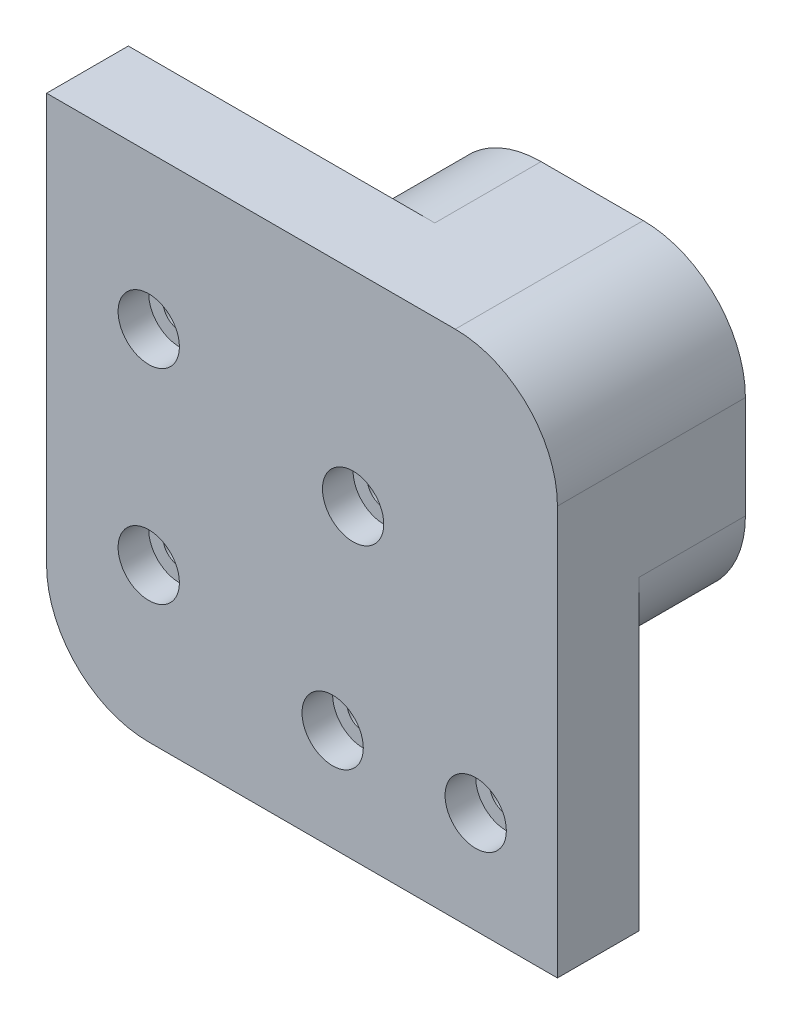
ISO-10303-21;
HEADER;
FILE_DESCRIPTION(('STEP AP214'),'2;1');
FILE_NAME('part.step','',(''),(''),'','','');
FILE_SCHEMA(('AUTOMOTIVE_DESIGN { 1 0 10303 214 1 1 1 1 }'));
ENDSEC;
DATA;
#1=APPLICATION_CONTEXT('core data for automotive mechanical design processes');
#2=APPLICATION_PROTOCOL_DEFINITION('international standard','automotive_design',2000,#1);
#3=PRODUCT_CONTEXT('',#1,'mechanical');
#4=PRODUCT('Part','Part','',(#3));
#5=PRODUCT_RELATED_PRODUCT_CATEGORY('part','',(#4));
#6=PRODUCT_DEFINITION_FORMATION('','',#4);
#7=PRODUCT_DEFINITION_CONTEXT('part definition',#1,'design');
#8=PRODUCT_DEFINITION('design','',#6,#7);
#9=PRODUCT_DEFINITION_SHAPE('','',#8);
#10=(LENGTH_UNIT() NAMED_UNIT(*) SI_UNIT(.MILLI.,.METRE.));
#11=(NAMED_UNIT(*) PLANE_ANGLE_UNIT() SI_UNIT($,.RADIAN.));
#12=(NAMED_UNIT(*) SI_UNIT($,.STERADIAN.) SOLID_ANGLE_UNIT());
#13=UNCERTAINTY_MEASURE_WITH_UNIT(LENGTH_MEASURE(1.E-05),#10,'distance_accuracy_value','');
#14=(GEOMETRIC_REPRESENTATION_CONTEXT(3) GLOBAL_UNCERTAINTY_ASSIGNED_CONTEXT((#13)) GLOBAL_UNIT_ASSIGNED_CONTEXT((#10,
#11,#12)) REPRESENTATION_CONTEXT('',''));
#15=CARTESIAN_POINT('',(0.,0.,0.));
#16=DIRECTION('',(0.,0.,1.));
#17=DIRECTION('',(1.,0.,0.));
#18=AXIS2_PLACEMENT_3D('',#15,#16,#17);
#19=CARTESIAN_POINT('',(20.,-130.028839026674,-52.8467532408376));
#20=DIRECTION('',(0.,0.,1.));
#21=DIRECTION('',(1.,0.,0.));
#22=AXIS2_PLACEMENT_3D('',#19,#20,#21);
#23=CYLINDRICAL_SURFACE('',#22,1.6);
#24=CARTESIAN_POINT('',(20.,-130.028839026674,-10.399949199898));
#25=DIRECTION('',(0.,0.,1.));
#26=DIRECTION('',(1.,0.,0.));
#27=AXIS2_PLACEMENT_3D('',#24,#25,#26);
#28=CIRCLE('',#27,1.6);
#29=CARTESIAN_POINT('',(21.6,-130.028839026674,-10.399949199898));
#30=VERTEX_POINT('',#29);
#31=EDGE_CURVE('E172',#30,#30,#28,.F.);
#32=ORIENTED_EDGE('',*,*,#31,.T.);
#33=EDGE_LOOP('',(#32));
#34=FACE_BOUND('',#33,.T.);
#35=CARTESIAN_POINT('',(20.,-130.028839026674,5.));
#36=DIRECTION('',(0.,0.,1.));
#37=DIRECTION('',(1.,0.,0.));
#38=AXIS2_PLACEMENT_3D('',#35,#36,#37);
#39=CIRCLE('',#38,1.6);
#40=CARTESIAN_POINT('',(21.6,-130.028839026674,5.));
#41=VERTEX_POINT('',#40);
#42=EDGE_CURVE('E151',#41,#41,#39,.F.);
#43=ORIENTED_EDGE('',*,*,#42,.F.);
#44=EDGE_LOOP('',(#43));
#45=FACE_BOUND('',#44,.T.);
#46=ADVANCED_FACE('F51',(#34,#45),#23,.F.);
#47=CARTESIAN_POINT('',(0.,-125.,8.));
#48=DIRECTION('',(0.,0.,-1.));
#49=DIRECTION('',(-1.,0.,0.));
#50=AXIS2_PLACEMENT_3D('',#47,#48,#49);
#51=CYLINDRICAL_SURFACE('',#50,1.6);
#52=CARTESIAN_POINT('',(0.,-125.,0.));
#53=DIRECTION('',(0.,0.,1.));
#54=DIRECTION('',(1.,0.,0.));
#55=AXIS2_PLACEMENT_3D('',#52,#53,#54);
#56=CIRCLE('',#55,1.6);
#57=CARTESIAN_POINT('',(1.60000000000002,-125.,0.));
#58=VERTEX_POINT('',#57);
#59=EDGE_CURVE('E221',#58,#58,#56,.T.);
#60=ORIENTED_EDGE('',*,*,#59,.F.);
#61=EDGE_LOOP('',(#60));
#62=FACE_BOUND('',#61,.T.);
#63=CARTESIAN_POINT('',(0.,-125.,5.));
#64=DIRECTION('',(0.,0.,1.));
#65=DIRECTION('',(1.,0.,0.));
#66=AXIS2_PLACEMENT_3D('',#63,#64,#65);
#67=CIRCLE('',#66,1.6);
#68=CARTESIAN_POINT('',(1.60000000000002,-125.,5.));
#69=VERTEX_POINT('',#68);
#70=EDGE_CURVE('E213',#69,#69,#67,.T.);
#71=ORIENTED_EDGE('',*,*,#70,.T.);
#72=EDGE_LOOP('',(#71));
#73=FACE_BOUND('',#72,.T.);
#74=ADVANCED_FACE('F365',(#62,#73),#51,.F.);
#75=CARTESIAN_POINT('',(0.,-145.,8.));
#76=DIRECTION('',(0.,0.,-1.));
#77=DIRECTION('',(-1.,0.,0.));
#78=AXIS2_PLACEMENT_3D('',#75,#76,#77);
#79=CYLINDRICAL_SURFACE('',#78,1.59999999999999);
#80=CARTESIAN_POINT('',(0.,-145.,0.));
#81=DIRECTION('',(0.,0.,1.));
#82=DIRECTION('',(1.,0.,0.));
#83=AXIS2_PLACEMENT_3D('',#80,#81,#82);
#84=CIRCLE('',#83,1.59999999999999);
#85=CARTESIAN_POINT('',(1.60000000000001,-145.,0.));
#86=VERTEX_POINT('',#85);
#87=EDGE_CURVE('E217',#86,#86,#84,.T.);
#88=ORIENTED_EDGE('',*,*,#87,.F.);
#89=EDGE_LOOP('',(#88));
#90=FACE_BOUND('',#89,.T.);
#91=CARTESIAN_POINT('',(0.,-145.,5.));
#92=DIRECTION('',(0.,0.,1.));
#93=DIRECTION('',(1.,0.,0.));
#94=AXIS2_PLACEMENT_3D('',#91,#92,#93);
#95=CIRCLE('',#94,1.59999999999999);
#96=CARTESIAN_POINT('',(1.60000000000001,-145.,5.));
#97=VERTEX_POINT('',#96);
#98=EDGE_CURVE('E272',#97,#97,#95,.T.);
#99=ORIENTED_EDGE('',*,*,#98,.T.);
#100=EDGE_LOOP('',(#99));
#101=FACE_BOUND('',#100,.T.);
#102=ADVANCED_FACE('F372',(#90,#101),#79,.F.);
#103=CARTESIAN_POINT('',(18.,-150.014419513337,8.));
#104=DIRECTION('',(0.,0.,-1.));
#105=DIRECTION('',(-1.,0.,0.));
#106=AXIS2_PLACEMENT_3D('',#103,#104,#105);
#107=CYLINDRICAL_SURFACE('',#106,1.59999999999999);
#108=CARTESIAN_POINT('',(18.,-150.014419513337,0.));
#109=DIRECTION('',(0.,0.,1.));
#110=DIRECTION('',(1.,0.,0.));
#111=AXIS2_PLACEMENT_3D('',#108,#109,#110);
#112=CIRCLE('',#111,1.59999999999999);
#113=CARTESIAN_POINT('',(19.6,-150.014419513337,0.));
#114=VERTEX_POINT('',#113);
#115=EDGE_CURVE('E212',#114,#114,#112,.T.);
#116=ORIENTED_EDGE('',*,*,#115,.F.);
#117=EDGE_LOOP('',(#116));
#118=FACE_BOUND('',#117,.T.);
#119=CARTESIAN_POINT('',(18.,-150.014419513337,5.));
#120=DIRECTION('',(0.,0.,1.));
#121=DIRECTION('',(1.,0.,0.));
#122=AXIS2_PLACEMENT_3D('',#119,#120,#121);
#123=CIRCLE('',#122,1.59999999999999);
#124=CARTESIAN_POINT('',(19.6,-150.014419513337,5.));
#125=VERTEX_POINT('',#124);
#126=EDGE_CURVE('E268',#125,#125,#123,.T.);
#127=ORIENTED_EDGE('',*,*,#126,.T.);
#128=EDGE_LOOP('',(#127));
#129=FACE_BOUND('',#128,.T.);
#130=ADVANCED_FACE('F421',(#118,#129),#107,.F.);
#131=CARTESIAN_POINT('',(32.,-150.014419513337,8.));
#132=DIRECTION('',(0.,0.,-1.));
#133=DIRECTION('',(-1.,0.,0.));
#134=AXIS2_PLACEMENT_3D('',#131,#132,#133);
#135=CYLINDRICAL_SURFACE('',#134,1.6);
#136=CARTESIAN_POINT('',(32.,-150.014419513337,0.));
#137=DIRECTION('',(0.,0.,1.));
#138=DIRECTION('',(1.,0.,0.));
#139=AXIS2_PLACEMENT_3D('',#136,#137,#138);
#140=CIRCLE('',#139,1.6);
#141=CARTESIAN_POINT('',(33.6,-150.014419513337,0.));
#142=VERTEX_POINT('',#141);
#143=EDGE_CURVE('E208',#142,#142,#140,.T.);
#144=ORIENTED_EDGE('',*,*,#143,.F.);
#145=EDGE_LOOP('',(#144));
#146=FACE_BOUND('',#145,.T.);
#147=CARTESIAN_POINT('',(32.,-150.014419513337,5.));
#148=DIRECTION('',(0.,0.,1.));
#149=DIRECTION('',(1.,0.,0.));
#150=AXIS2_PLACEMENT_3D('',#147,#148,#149);
#151=CIRCLE('',#150,1.6);
#152=CARTESIAN_POINT('',(33.6,-150.014419513337,5.));
#153=VERTEX_POINT('',#152);
#154=EDGE_CURVE('E179',#153,#153,#151,.T.);
#155=ORIENTED_EDGE('',*,*,#154,.T.);
#156=EDGE_LOOP('',(#155));
#157=FACE_BOUND('',#156,.T.);
#158=ADVANCED_FACE('F418',(#146,#157),#135,.F.);
#159=CARTESIAN_POINT('',(0.,0.,8.));
#160=DIRECTION('',(0.,0.,1.));
#161=DIRECTION('',(1.,0.,0.));
#162=AXIS2_PLACEMENT_3D('',#159,#160,#161);
#163=PLANE('',#162);
#164=CARTESIAN_POINT('',(20.,-130.028839026674,8.));
#165=DIRECTION('',(0.,0.,1.));
#166=DIRECTION('',(1.,0.,0.));
#167=AXIS2_PLACEMENT_3D('',#164,#165,#166);
#168=CIRCLE('',#167,3.);
#169=CARTESIAN_POINT('',(23.,-130.028839026674,8.));
#170=VERTEX_POINT('',#169);
#171=EDGE_CURVE('E592',#170,#170,#168,.T.);
#172=ORIENTED_EDGE('',*,*,#171,.F.);
#173=EDGE_LOOP('',(#172));
#174=FACE_BOUND('',#173,.T.);
#175=DIRECTION('',(0.,1.,0.));
#176=VECTOR('',#175,1.);
#177=CARTESIAN_POINT('',(40.,-160.,8.));
#178=LINE('',#177,#176);
#179=CARTESIAN_POINT('',(40.,-160.,8.));
#180=VERTEX_POINT('',#179);
#181=CARTESIAN_POINT('',(40.,-120.,8.));
#182=VERTEX_POINT('',#181);
#183=EDGE_CURVE('E233',#180,#182,#178,.T.);
#184=ORIENTED_EDGE('',*,*,#183,.T.);
#185=CARTESIAN_POINT('',(30.,-120.,8.));
#186=DIRECTION('',(0.,0.,1.));
#187=DIRECTION('',(1.,0.,0.));
#188=AXIS2_PLACEMENT_3D('',#185,#186,#187);
#189=CIRCLE('',#188,10.);
#190=CARTESIAN_POINT('',(30.,-110.,8.));
#191=VERTEX_POINT('',#190);
#192=EDGE_CURVE('E316',#182,#191,#189,.T.);
#193=ORIENTED_EDGE('',*,*,#192,.T.);
#194=DIRECTION('',(-1.,0.,0.));
#195=VECTOR('',#194,1.);
#196=CARTESIAN_POINT('',(-9.99999999999999,-110.,8.));
#197=LINE('',#196,#195);
#198=CARTESIAN_POINT('',(-9.99999999999999,-110.,8.));
#199=VERTEX_POINT('',#198);
#200=EDGE_CURVE('E237',#191,#199,#197,.T.);
#201=ORIENTED_EDGE('',*,*,#200,.T.);
#202=DIRECTION('',(0.,-1.,0.));
#203=VECTOR('',#202,1.);
#204=CARTESIAN_POINT('',(-9.99999999999999,-110.,8.));
#205=LINE('',#204,#203);
#206=CARTESIAN_POINT('',(-9.99999999999998,-150.,8.));
#207=VERTEX_POINT('',#206);
#208=EDGE_CURVE('E226',#199,#207,#205,.T.);
#209=ORIENTED_EDGE('',*,*,#208,.T.);
#210=CARTESIAN_POINT('',(0.,-150.,8.));
#211=DIRECTION('',(0.,0.,1.));
#212=DIRECTION('',(1.,0.,0.));
#213=AXIS2_PLACEMENT_3D('',#210,#211,#212);
#214=CIRCLE('',#213,10.);
#215=CARTESIAN_POINT('',(0.,-160.,8.));
#216=VERTEX_POINT('',#215);
#217=EDGE_CURVE('E288',#207,#216,#214,.T.);
#218=ORIENTED_EDGE('',*,*,#217,.T.);
#219=DIRECTION('',(1.,0.,0.));
#220=VECTOR('',#219,1.);
#221=CARTESIAN_POINT('',(-9.99999999999998,-160.,8.));
#222=LINE('',#221,#220);
#223=EDGE_CURVE('E230',#216,#180,#222,.T.);
#224=ORIENTED_EDGE('',*,*,#223,.T.);
#225=EDGE_LOOP('',(#184,#193,#201,#209,#218,#224));
#226=FACE_BOUND('',#225,.T.);
#227=CARTESIAN_POINT('',(32.,-150.014419513337,8.));
#228=DIRECTION('',(0.,0.,1.));
#229=DIRECTION('',(1.,0.,0.));
#230=AXIS2_PLACEMENT_3D('',#227,#228,#229);
#231=CIRCLE('',#230,3.);
#232=CARTESIAN_POINT('',(35.,-150.014419513337,8.));
#233=VERTEX_POINT('',#232);
#234=EDGE_CURVE('E180',#233,#233,#231,.T.);
#235=ORIENTED_EDGE('',*,*,#234,.F.);
#236=EDGE_LOOP('',(#235));
#237=FACE_BOUND('',#236,.T.);
#238=CARTESIAN_POINT('',(18.,-150.014419513337,8.));
#239=DIRECTION('',(0.,0.,1.));
#240=DIRECTION('',(1.,0.,0.));
#241=AXIS2_PLACEMENT_3D('',#238,#239,#240);
#242=CIRCLE('',#241,3.);
#243=CARTESIAN_POINT('',(21.,-150.014419513337,8.));
#244=VERTEX_POINT('',#243);
#245=EDGE_CURVE('E184',#244,#244,#242,.T.);
#246=ORIENTED_EDGE('',*,*,#245,.F.);
#247=EDGE_LOOP('',(#246));
#248=FACE_BOUND('',#247,.T.);
#249=CARTESIAN_POINT('',(0.,-145.,8.));
#250=DIRECTION('',(0.,0.,1.));
#251=DIRECTION('',(1.,0.,0.));
#252=AXIS2_PLACEMENT_3D('',#249,#250,#251);
#253=CIRCLE('',#252,3.);
#254=CARTESIAN_POINT('',(3.00000000000002,-145.,8.));
#255=VERTEX_POINT('',#254);
#256=EDGE_CURVE('E192',#255,#255,#253,.T.);
#257=ORIENTED_EDGE('',*,*,#256,.F.);
#258=EDGE_LOOP('',(#257));
#259=FACE_BOUND('',#258,.T.);
#260=CARTESIAN_POINT('',(0.,-125.,8.));
#261=DIRECTION('',(0.,0.,1.));
#262=DIRECTION('',(1.,0.,0.));
#263=AXIS2_PLACEMENT_3D('',#260,#261,#262);
#264=CIRCLE('',#263,3.);
#265=CARTESIAN_POINT('',(3.00000000000002,-125.,8.));
#266=VERTEX_POINT('',#265);
#267=EDGE_CURVE('E200',#266,#266,#264,.T.);
#268=ORIENTED_EDGE('',*,*,#267,.F.);
#269=EDGE_LOOP('',(#268));
#270=FACE_BOUND('',#269,.T.);
#271=ADVANCED_FACE('F336',(#174,#226,#237,#248,#259,#270),#163,.T.);
#272=CARTESIAN_POINT('',(0.,0.,0.));
#273=DIRECTION('',(0.,0.,1.));
#274=DIRECTION('',(1.,0.,0.));
#275=AXIS2_PLACEMENT_3D('',#272,#273,#274);
#276=PLANE('',#275);
#277=DIRECTION('',(1.,0.,0.));
#278=VECTOR('',#277,1.);
#279=CARTESIAN_POINT('',(-9.99999999999998,-160.,0.));
#280=LINE('',#279,#278);
#281=CARTESIAN_POINT('',(0.,-160.,0.));
#282=VERTEX_POINT('',#281);
#283=CARTESIAN_POINT('',(40.,-160.,0.));
#284=VERTEX_POINT('',#283);
#285=EDGE_CURVE('E244',#282,#284,#280,.T.);
#286=ORIENTED_EDGE('',*,*,#285,.F.);
#287=CARTESIAN_POINT('',(0.,-150.,0.));
#288=DIRECTION('',(0.,0.,1.));
#289=DIRECTION('',(1.,0.,0.));
#290=AXIS2_PLACEMENT_3D('',#287,#288,#289);
#291=CIRCLE('',#290,10.);
#292=CARTESIAN_POINT('',(-9.99999999999998,-150.,0.));
#293=VERTEX_POINT('',#292);
#294=EDGE_CURVE('E282',#282,#293,#291,.F.);
#295=ORIENTED_EDGE('',*,*,#294,.T.);
#296=DIRECTION('',(0.,-1.,0.));
#297=VECTOR('',#296,1.);
#298=CARTESIAN_POINT('',(-9.99999999999999,-110.,0.));
#299=LINE('',#298,#297);
#300=CARTESIAN_POINT('',(-9.99999999999999,-110.,0.));
#301=VERTEX_POINT('',#300);
#302=EDGE_CURVE('E225',#301,#293,#299,.T.);
#303=ORIENTED_EDGE('',*,*,#302,.F.);
#304=DIRECTION('',(-1.,0.,0.));
#305=VECTOR('',#304,1.);
#306=CARTESIAN_POINT('',(-9.99999999999999,-110.,0.));
#307=LINE('',#306,#305);
#308=CARTESIAN_POINT('',(20.,-110.,0.));
#309=VERTEX_POINT('',#308);
#310=EDGE_CURVE('E69',#309,#301,#307,.T.);
#311=ORIENTED_EDGE('',*,*,#310,.F.);
#312=CARTESIAN_POINT('',(20.,-120.,0.));
#313=DIRECTION('',(0.,0.,1.));
#314=DIRECTION('',(1.,0.,0.));
#315=AXIS2_PLACEMENT_3D('',#312,#313,#314);
#316=CIRCLE('',#315,10.);
#317=CARTESIAN_POINT('',(10.,-120.,0.));
#318=VERTEX_POINT('',#317);
#319=EDGE_CURVE('E11',#309,#318,#316,.T.);
#320=ORIENTED_EDGE('',*,*,#319,.T.);
#321=DIRECTION('',(0.,1.,0.));
#322=VECTOR('',#321,1.);
#323=CARTESIAN_POINT('',(10.,-110.,0.));
#324=LINE('',#323,#322);
#325=CARTESIAN_POINT('',(10.,-130.028839026674,0.));
#326=VERTEX_POINT('',#325);
#327=EDGE_CURVE('E252',#326,#318,#324,.T.);
#328=ORIENTED_EDGE('',*,*,#327,.F.);
#329=CARTESIAN_POINT('',(20.,-130.028839026674,0.));
#330=DIRECTION('',(0.,0.,1.));
#331=DIRECTION('',(1.,0.,0.));
#332=AXIS2_PLACEMENT_3D('',#329,#330,#331);
#333=CIRCLE('',#332,10.);
#334=CARTESIAN_POINT('',(20.,-140.028839026674,0.));
#335=VERTEX_POINT('',#334);
#336=EDGE_CURVE('E291',#326,#335,#333,.T.);
#337=ORIENTED_EDGE('',*,*,#336,.T.);
#338=DIRECTION('',(-1.,0.,0.));
#339=VECTOR('',#338,1.);
#340=CARTESIAN_POINT('',(10.,-140.028839026674,0.));
#341=LINE('',#340,#339);
#342=CARTESIAN_POINT('',(30.,-140.028839026674,0.));
#343=VERTEX_POINT('',#342);
#344=EDGE_CURVE('E163',#343,#335,#341,.T.);
#345=ORIENTED_EDGE('',*,*,#344,.F.);
#346=CARTESIAN_POINT('',(30.,-130.028839026674,0.));
#347=DIRECTION('',(0.,0.,1.));
#348=DIRECTION('',(1.,0.,0.));
#349=AXIS2_PLACEMENT_3D('',#346,#347,#348);
#350=CIRCLE('',#349,10.);
#351=CARTESIAN_POINT('',(40.,-130.028839026674,0.));
#352=VERTEX_POINT('',#351);
#353=EDGE_CURVE('E59',#343,#352,#350,.T.);
#354=ORIENTED_EDGE('',*,*,#353,.T.);
#355=DIRECTION('',(0.,1.,0.));
#356=VECTOR('',#355,1.);
#357=CARTESIAN_POINT('',(40.,-160.,0.));
#358=LINE('',#357,#356);
#359=EDGE_CURVE('E247',#284,#352,#358,.T.);
#360=ORIENTED_EDGE('',*,*,#359,.F.);
#361=EDGE_LOOP('',(#286,#295,#303,#311,#320,#328,#337,#345,#354,#360));
#362=FACE_BOUND('',#361,.T.);
#363=ORIENTED_EDGE('',*,*,#59,.T.);
#364=EDGE_LOOP('',(#363));
#365=FACE_BOUND('',#364,.T.);
#366=ORIENTED_EDGE('',*,*,#87,.T.);
#367=EDGE_LOOP('',(#366));
#368=FACE_BOUND('',#367,.T.);
#369=ORIENTED_EDGE('',*,*,#115,.T.);
#370=EDGE_LOOP('',(#369));
#371=FACE_BOUND('',#370,.T.);
#372=ORIENTED_EDGE('',*,*,#143,.T.);
#373=EDGE_LOOP('',(#372));
#374=FACE_BOUND('',#373,.T.);
#375=ADVANCED_FACE('F321',(#362,#365,#368,#371,#374),#276,.F.);
#376=CARTESIAN_POINT('',(-9.99999999999999,-110.,8.));
#377=DIRECTION('',(1.,0.,0.));
#378=DIRECTION('',(0.,1.,0.));
#379=AXIS2_PLACEMENT_3D('',#376,#377,#378);
#380=PLANE('',#379);
#381=ORIENTED_EDGE('',*,*,#302,.T.);
#382=DIRECTION('',(0.,0.,-1.));
#383=VECTOR('',#382,1.);
#384=CARTESIAN_POINT('',(-9.99999999999998,-150.,8.));
#385=LINE('',#384,#383);
#386=EDGE_CURVE('E285',#293,#207,#385,.F.);
#387=ORIENTED_EDGE('',*,*,#386,.T.);
#388=ORIENTED_EDGE('',*,*,#208,.F.);
#389=DIRECTION('',(0.,0.,-1.));
#390=VECTOR('',#389,1.);
#391=CARTESIAN_POINT('',(-9.99999999999999,-110.,8.));
#392=LINE('',#391,#390);
#393=EDGE_CURVE('E240',#199,#301,#392,.T.);
#394=ORIENTED_EDGE('',*,*,#393,.T.);
#395=EDGE_LOOP('',(#381,#387,#388,#394));
#396=FACE_BOUND('',#395,.T.);
#397=ADVANCED_FACE('F348',(#396),#380,.F.);
#398=CARTESIAN_POINT('',(-9.99999999999998,-160.,8.));
#399=DIRECTION('',(0.,1.,0.));
#400=DIRECTION('',(0.,0.,1.));
#401=AXIS2_PLACEMENT_3D('',#398,#399,#400);
#402=PLANE('',#401);
#403=ORIENTED_EDGE('',*,*,#223,.F.);
#404=DIRECTION('',(0.,0.,-1.));
#405=VECTOR('',#404,1.);
#406=CARTESIAN_POINT('',(0.,-160.,8.));
#407=LINE('',#406,#405);
#408=EDGE_CURVE('E264',#216,#282,#407,.T.);
#409=ORIENTED_EDGE('',*,*,#408,.T.);
#410=ORIENTED_EDGE('',*,*,#285,.T.);
#411=DIRECTION('',(0.,0.,-1.));
#412=VECTOR('',#411,1.);
#413=CARTESIAN_POINT('',(40.,-160.,8.));
#414=LINE('',#413,#412);
#415=EDGE_CURVE('E260',#180,#284,#414,.T.);
#416=ORIENTED_EDGE('',*,*,#415,.F.);
#417=EDGE_LOOP('',(#403,#409,#410,#416));
#418=FACE_BOUND('',#417,.T.);
#419=ADVANCED_FACE('F344',(#418),#402,.F.);
#420=CARTESIAN_POINT('',(40.,-160.,8.));
#421=DIRECTION('',(-1.,0.,0.));
#422=DIRECTION('',(0.,-1.,0.));
#423=AXIS2_PLACEMENT_3D('',#420,#421,#422);
#424=PLANE('',#423);
#425=ORIENTED_EDGE('',*,*,#359,.T.);
#426=DIRECTION('',(0.,0.,1.));
#427=VECTOR('',#426,1.);
#428=CARTESIAN_POINT('',(40.,-130.028839026674,8.));
#429=LINE('',#428,#427);
#430=CARTESIAN_POINT('',(40.,-130.028839026674,-10.399949199898));
#431=VERTEX_POINT('',#430);
#432=EDGE_CURVE('E302',#352,#431,#429,.F.);
#433=ORIENTED_EDGE('',*,*,#432,.T.);
#434=DIRECTION('',(0.,-1.,0.));
#435=VECTOR('',#434,1.);
#436=CARTESIAN_POINT('',(40.,0.,-10.399949199898));
#437=LINE('',#436,#435);
#438=CARTESIAN_POINT('',(40.,-120.,-10.399949199898));
#439=VERTEX_POINT('',#438);
#440=EDGE_CURVE('E173',#439,#431,#437,.T.);
#441=ORIENTED_EDGE('',*,*,#440,.F.);
#442=DIRECTION('',(0.,0.,1.));
#443=VECTOR('',#442,1.);
#444=CARTESIAN_POINT('',(40.,-120.,8.));
#445=LINE('',#444,#443);
#446=EDGE_CURVE('E299',#439,#182,#445,.T.);
#447=ORIENTED_EDGE('',*,*,#446,.T.);
#448=ORIENTED_EDGE('',*,*,#183,.F.);
#449=ORIENTED_EDGE('',*,*,#415,.T.);
#450=EDGE_LOOP('',(#425,#433,#441,#447,#448,#449));
#451=FACE_BOUND('',#450,.T.);
#452=ADVANCED_FACE('F327',(#451),#424,.F.);
#453=CARTESIAN_POINT('',(-9.99999999999999,-110.,8.));
#454=DIRECTION('',(0.,-1.,0.));
#455=DIRECTION('',(0.,0.,-1.));
#456=AXIS2_PLACEMENT_3D('',#453,#454,#455);
#457=PLANE('',#456);
#458=DIRECTION('',(1.,0.,0.));
#459=VECTOR('',#458,1.);
#460=CARTESIAN_POINT('',(0.,-110.,-10.399949199898));
#461=LINE('',#460,#459);
#462=CARTESIAN_POINT('',(20.,-110.,-10.399949199898));
#463=VERTEX_POINT('',#462);
#464=CARTESIAN_POINT('',(30.,-110.,-10.399949199898));
#465=VERTEX_POINT('',#464);
#466=EDGE_CURVE('E169',#463,#465,#461,.T.);
#467=ORIENTED_EDGE('',*,*,#466,.F.);
#468=DIRECTION('',(0.,0.,1.));
#469=VECTOR('',#468,1.);
#470=CARTESIAN_POINT('',(20.,-110.,8.));
#471=LINE('',#470,#469);
#472=EDGE_CURVE('E311',#463,#309,#471,.T.);
#473=ORIENTED_EDGE('',*,*,#472,.T.);
#474=ORIENTED_EDGE('',*,*,#310,.T.);
#475=ORIENTED_EDGE('',*,*,#393,.F.);
#476=ORIENTED_EDGE('',*,*,#200,.F.);
#477=DIRECTION('',(0.,0.,1.));
#478=VECTOR('',#477,1.);
#479=CARTESIAN_POINT('',(30.,-110.,8.));
#480=LINE('',#479,#478);
#481=EDGE_CURVE('E309',#191,#465,#480,.F.);
#482=ORIENTED_EDGE('',*,*,#481,.T.);
#483=EDGE_LOOP('',(#467,#473,#474,#475,#476,#482));
#484=FACE_BOUND('',#483,.T.);
#485=ADVANCED_FACE('F398',(#484),#457,.F.);
#486=CARTESIAN_POINT('',(32.,-150.014419513337,5.));
#487=DIRECTION('',(0.,0.,1.));
#488=DIRECTION('',(1.,0.,0.));
#489=AXIS2_PLACEMENT_3D('',#486,#487,#488);
#490=CYLINDRICAL_SURFACE('',#489,3.);
#491=CARTESIAN_POINT('',(32.,-150.014419513337,5.));
#492=DIRECTION('',(0.,0.,1.));
#493=DIRECTION('',(1.,0.,0.));
#494=AXIS2_PLACEMENT_3D('',#491,#492,#493);
#495=CIRCLE('',#494,3.);
#496=CARTESIAN_POINT('',(35.,-150.014419513337,5.));
#497=VERTEX_POINT('',#496);
#498=EDGE_CURVE('E175',#497,#497,#495,.T.);
#499=ORIENTED_EDGE('',*,*,#498,.F.);
#500=EDGE_LOOP('',(#499));
#501=FACE_BOUND('',#500,.T.);
#502=ORIENTED_EDGE('',*,*,#234,.T.);
#503=EDGE_LOOP('',(#502));
#504=FACE_BOUND('',#503,.T.);
#505=ADVANCED_FACE('F394',(#501,#504),#490,.F.);
#506=CARTESIAN_POINT('',(32.,-150.014419513337,5.));
#507=DIRECTION('',(0.,0.,1.));
#508=DIRECTION('',(1.,0.,0.));
#509=AXIS2_PLACEMENT_3D('',#506,#507,#508);
#510=PLANE('',#509);
#511=ORIENTED_EDGE('',*,*,#154,.F.);
#512=EDGE_LOOP('',(#511));
#513=FACE_BOUND('',#512,.T.);
#514=ORIENTED_EDGE('',*,*,#498,.T.);
#515=EDGE_LOOP('',(#514));
#516=FACE_BOUND('',#515,.T.);
#517=ADVANCED_FACE('F390',(#513,#516),#510,.T.);
#518=CARTESIAN_POINT('',(18.,-150.014419513337,5.));
#519=DIRECTION('',(0.,0.,1.));
#520=DIRECTION('',(1.,0.,0.));
#521=AXIS2_PLACEMENT_3D('',#518,#519,#520);
#522=CYLINDRICAL_SURFACE('',#521,3.);
#523=CARTESIAN_POINT('',(18.,-150.014419513337,5.));
#524=DIRECTION('',(0.,0.,1.));
#525=DIRECTION('',(1.,0.,0.));
#526=AXIS2_PLACEMENT_3D('',#523,#524,#525);
#527=CIRCLE('',#526,3.);
#528=CARTESIAN_POINT('',(21.,-150.014419513337,5.));
#529=VERTEX_POINT('',#528);
#530=EDGE_CURVE('E188',#529,#529,#527,.T.);
#531=ORIENTED_EDGE('',*,*,#530,.F.);
#532=EDGE_LOOP('',(#531));
#533=FACE_BOUND('',#532,.T.);
#534=ORIENTED_EDGE('',*,*,#245,.T.);
#535=EDGE_LOOP('',(#534));
#536=FACE_BOUND('',#535,.T.);
#537=ADVANCED_FACE('F393',(#533,#536),#522,.F.);
#538=CARTESIAN_POINT('',(18.,-150.014419513337,5.));
#539=DIRECTION('',(0.,0.,1.));
#540=DIRECTION('',(1.,0.,0.));
#541=AXIS2_PLACEMENT_3D('',#538,#539,#540);
#542=PLANE('',#541);
#543=ORIENTED_EDGE('',*,*,#126,.F.);
#544=EDGE_LOOP('',(#543));
#545=FACE_BOUND('',#544,.T.);
#546=ORIENTED_EDGE('',*,*,#530,.T.);
#547=EDGE_LOOP('',(#546));
#548=FACE_BOUND('',#547,.T.);
#549=ADVANCED_FACE('F402',(#545,#548),#542,.T.);
#550=CARTESIAN_POINT('',(0.,-145.,5.));
#551=DIRECTION('',(0.,0.,1.));
#552=DIRECTION('',(1.,0.,0.));
#553=AXIS2_PLACEMENT_3D('',#550,#551,#552);
#554=CYLINDRICAL_SURFACE('',#553,3.);
#555=CARTESIAN_POINT('',(0.,-145.,5.));
#556=DIRECTION('',(0.,0.,1.));
#557=DIRECTION('',(1.,0.,0.));
#558=AXIS2_PLACEMENT_3D('',#555,#556,#557);
#559=CIRCLE('',#558,3.);
#560=CARTESIAN_POINT('',(3.00000000000002,-145.,5.));
#561=VERTEX_POINT('',#560);
#562=EDGE_CURVE('E196',#561,#561,#559,.T.);
#563=ORIENTED_EDGE('',*,*,#562,.F.);
#564=EDGE_LOOP('',(#563));
#565=FACE_BOUND('',#564,.T.);
#566=ORIENTED_EDGE('',*,*,#256,.T.);
#567=EDGE_LOOP('',(#566));
#568=FACE_BOUND('',#567,.T.);
#569=ADVANCED_FACE('F406',(#565,#568),#554,.F.);
#570=CARTESIAN_POINT('',(0.,-145.,5.));
#571=DIRECTION('',(0.,0.,1.));
#572=DIRECTION('',(1.,0.,0.));
#573=AXIS2_PLACEMENT_3D('',#570,#571,#572);
#574=PLANE('',#573);
#575=ORIENTED_EDGE('',*,*,#98,.F.);
#576=EDGE_LOOP('',(#575));
#577=FACE_BOUND('',#576,.T.);
#578=ORIENTED_EDGE('',*,*,#562,.T.);
#579=EDGE_LOOP('',(#578));
#580=FACE_BOUND('',#579,.T.);
#581=ADVANCED_FACE('F410',(#577,#580),#574,.T.);
#582=CARTESIAN_POINT('',(0.,-125.,5.));
#583=DIRECTION('',(0.,0.,1.));
#584=DIRECTION('',(1.,0.,0.));
#585=AXIS2_PLACEMENT_3D('',#582,#583,#584);
#586=CYLINDRICAL_SURFACE('',#585,3.);
#587=CARTESIAN_POINT('',(0.,-125.,5.));
#588=DIRECTION('',(0.,0.,1.));
#589=DIRECTION('',(1.,0.,0.));
#590=AXIS2_PLACEMENT_3D('',#587,#588,#589);
#591=CIRCLE('',#590,3.);
#592=CARTESIAN_POINT('',(3.00000000000002,-125.,5.));
#593=VERTEX_POINT('',#592);
#594=EDGE_CURVE('E204',#593,#593,#591,.T.);
#595=ORIENTED_EDGE('',*,*,#594,.F.);
#596=EDGE_LOOP('',(#595));
#597=FACE_BOUND('',#596,.T.);
#598=ORIENTED_EDGE('',*,*,#267,.T.);
#599=EDGE_LOOP('',(#598));
#600=FACE_BOUND('',#599,.T.);
#601=ADVANCED_FACE('F359',(#597,#600),#586,.F.);
#602=CARTESIAN_POINT('',(0.,-125.,5.));
#603=DIRECTION('',(0.,0.,1.));
#604=DIRECTION('',(1.,0.,0.));
#605=AXIS2_PLACEMENT_3D('',#602,#603,#604);
#606=PLANE('',#605);
#607=ORIENTED_EDGE('',*,*,#70,.F.);
#608=EDGE_LOOP('',(#607));
#609=FACE_BOUND('',#608,.T.);
#610=ORIENTED_EDGE('',*,*,#594,.T.);
#611=EDGE_LOOP('',(#610));
#612=FACE_BOUND('',#611,.T.);
#613=ADVANCED_FACE('F353',(#609,#612),#606,.T.);
#614=CARTESIAN_POINT('',(0.,-150.,8.));
#615=DIRECTION('',(0.,0.,-1.));
#616=DIRECTION('',(-1.,0.,0.));
#617=AXIS2_PLACEMENT_3D('',#614,#615,#616);
#618=CYLINDRICAL_SURFACE('',#617,10.);
#619=ORIENTED_EDGE('',*,*,#217,.F.);
#620=ORIENTED_EDGE('',*,*,#386,.F.);
#621=ORIENTED_EDGE('',*,*,#294,.F.);
#622=ORIENTED_EDGE('',*,*,#408,.F.);
#623=EDGE_LOOP('',(#619,#620,#621,#622));
#624=FACE_BOUND('',#623,.T.);
#625=ADVANCED_FACE('F351',(#624),#618,.T.);
#626=CARTESIAN_POINT('',(20.,-130.028839026674,-52.8467532408376));
#627=DIRECTION('',(0.,0.,1.));
#628=DIRECTION('',(1.,0.,0.));
#629=AXIS2_PLACEMENT_3D('',#626,#627,#628);
#630=CYLINDRICAL_SURFACE('',#629,10.);
#631=DIRECTION('',(0.,0.,1.));
#632=VECTOR('',#631,1.);
#633=CARTESIAN_POINT('',(20.,-140.028839026674,-52.8467532408376));
#634=LINE('',#633,#632);
#635=CARTESIAN_POINT('',(20.,-140.028839026674,-10.399949199898));
#636=VERTEX_POINT('',#635);
#637=EDGE_CURVE('E156',#636,#335,#634,.T.);
#638=ORIENTED_EDGE('',*,*,#637,.T.);
#639=ORIENTED_EDGE('',*,*,#336,.F.);
#640=DIRECTION('',(0.,0.,1.));
#641=VECTOR('',#640,1.);
#642=CARTESIAN_POINT('',(10.,-130.028839026674,-52.8467532408376));
#643=LINE('',#642,#641);
#644=CARTESIAN_POINT('',(10.,-130.028839026674,-10.399949199898));
#645=VERTEX_POINT('',#644);
#646=EDGE_CURVE('E159',#645,#326,#643,.T.);
#647=ORIENTED_EDGE('',*,*,#646,.F.);
#648=CARTESIAN_POINT('',(20.,-130.028839026674,-10.399949199898));
#649=DIRECTION('',(0.,0.,1.));
#650=DIRECTION('',(1.,0.,0.));
#651=AXIS2_PLACEMENT_3D('',#648,#649,#650);
#652=CIRCLE('',#651,10.);
#653=EDGE_CURVE('E143',#645,#636,#652,.T.);
#654=ORIENTED_EDGE('',*,*,#653,.T.);
#655=EDGE_LOOP('',(#638,#639,#647,#654));
#656=FACE_BOUND('',#655,.T.);
#657=ADVANCED_FACE('F155',(#656),#630,.T.);
#658=CARTESIAN_POINT('',(0.,-140.028839026674,-52.8467532408376));
#659=DIRECTION('',(0.,1.,0.));
#660=DIRECTION('',(0.,0.,1.));
#661=AXIS2_PLACEMENT_3D('',#658,#659,#660);
#662=PLANE('',#661);
#663=DIRECTION('',(1.,0.,0.));
#664=VECTOR('',#663,1.);
#665=CARTESIAN_POINT('',(0.,-140.028839026674,-10.399949199898));
#666=LINE('',#665,#664);
#667=CARTESIAN_POINT('',(30.,-140.028839026674,-10.399949199898));
#668=VERTEX_POINT('',#667);
#669=EDGE_CURVE('E137',#636,#668,#666,.T.);
#670=ORIENTED_EDGE('',*,*,#669,.T.);
#671=DIRECTION('',(0.,0.,1.));
#672=VECTOR('',#671,1.);
#673=CARTESIAN_POINT('',(30.,-140.028839026674,-52.8467532408376));
#674=LINE('',#673,#672);
#675=EDGE_CURVE('E294',#668,#343,#674,.T.);
#676=ORIENTED_EDGE('',*,*,#675,.T.);
#677=ORIENTED_EDGE('',*,*,#344,.T.);
#678=ORIENTED_EDGE('',*,*,#637,.F.);
#679=EDGE_LOOP('',(#670,#676,#677,#678));
#680=FACE_BOUND('',#679,.T.);
#681=ADVANCED_FACE('F161',(#680),#662,.F.);
#682=CARTESIAN_POINT('',(10.,0.,-52.8467532408376));
#683=DIRECTION('',(1.,0.,0.));
#684=DIRECTION('',(0.,1.,0.));
#685=AXIS2_PLACEMENT_3D('',#682,#683,#684);
#686=PLANE('',#685);
#687=ORIENTED_EDGE('',*,*,#327,.T.);
#688=DIRECTION('',(0.,0.,1.));
#689=VECTOR('',#688,1.);
#690=CARTESIAN_POINT('',(10.,-120.,-52.8467532408376));
#691=LINE('',#690,#689);
#692=CARTESIAN_POINT('',(10.,-120.,-10.399949199898));
#693=VERTEX_POINT('',#692);
#694=EDGE_CURVE('E314',#318,#693,#691,.F.);
#695=ORIENTED_EDGE('',*,*,#694,.T.);
#696=DIRECTION('',(0.,-1.,0.));
#697=VECTOR('',#696,1.);
#698=CARTESIAN_POINT('',(10.,0.,-10.399949199898));
#699=LINE('',#698,#697);
#700=EDGE_CURVE('E164',#693,#645,#699,.T.);
#701=ORIENTED_EDGE('',*,*,#700,.T.);
#702=ORIENTED_EDGE('',*,*,#646,.T.);
#703=EDGE_LOOP('',(#687,#695,#701,#702));
#704=FACE_BOUND('',#703,.T.);
#705=ADVANCED_FACE('F381',(#704),#686,.F.);
#706=CARTESIAN_POINT('',(131.373730251444,-9.92262591848699,-10.399949199898));
#707=DIRECTION('',(0.,0.,1.));
#708=DIRECTION('',(0.,-1.,0.));
#709=AXIS2_PLACEMENT_3D('',#706,#707,#708);
#710=PLANE('',#709);
#711=ORIENTED_EDGE('',*,*,#440,.T.);
#712=CARTESIAN_POINT('',(30.,-130.028839026674,-10.399949199898));
#713=DIRECTION('',(0.,0.,1.));
#714=DIRECTION('',(1.,0.,0.));
#715=AXIS2_PLACEMENT_3D('',#712,#713,#714);
#716=CIRCLE('',#715,10.);
#717=EDGE_CURVE('E146',#431,#668,#716,.F.);
#718=ORIENTED_EDGE('',*,*,#717,.T.);
#719=ORIENTED_EDGE('',*,*,#669,.F.);
#720=ORIENTED_EDGE('',*,*,#653,.F.);
#721=ORIENTED_EDGE('',*,*,#700,.F.);
#722=CARTESIAN_POINT('',(20.,-120.,-10.399949199898));
#723=DIRECTION('',(0.,0.,1.));
#724=DIRECTION('',(1.,0.,0.));
#725=AXIS2_PLACEMENT_3D('',#722,#723,#724);
#726=CIRCLE('',#725,10.);
#727=EDGE_CURVE('E306',#693,#463,#726,.F.);
#728=ORIENTED_EDGE('',*,*,#727,.T.);
#729=ORIENTED_EDGE('',*,*,#466,.T.);
#730=CARTESIAN_POINT('',(30.,-120.,-10.399949199898));
#731=DIRECTION('',(0.,0.,1.));
#732=DIRECTION('',(1.,0.,0.));
#733=AXIS2_PLACEMENT_3D('',#730,#731,#732);
#734=CIRCLE('',#733,10.);
#735=EDGE_CURVE('E304',#465,#439,#734,.F.);
#736=ORIENTED_EDGE('',*,*,#735,.T.);
#737=EDGE_LOOP('',(#711,#718,#719,#720,#721,#728,#729,#736));
#738=FACE_BOUND('',#737,.T.);
#739=ORIENTED_EDGE('',*,*,#31,.F.);
#740=EDGE_LOOP('',(#739));
#741=FACE_BOUND('',#740,.T.);
#742=ADVANCED_FACE('F140',(#738,#741),#710,.F.);
#743=CARTESIAN_POINT('',(20.,-130.028839026674,5.));
#744=DIRECTION('',(0.,0.,1.));
#745=DIRECTION('',(1.,0.,0.));
#746=AXIS2_PLACEMENT_3D('',#743,#744,#745);
#747=PLANE('',#746);
#748=CARTESIAN_POINT('',(20.,-130.028839026674,5.));
#749=DIRECTION('',(0.,0.,1.));
#750=DIRECTION('',(1.,0.,0.));
#751=AXIS2_PLACEMENT_3D('',#748,#749,#750);
#752=CIRCLE('',#751,3.);
#753=CARTESIAN_POINT('',(23.,-130.028839026674,5.));
#754=VERTEX_POINT('',#753);
#755=EDGE_CURVE('E297',#754,#754,#752,.T.);
#756=ORIENTED_EDGE('',*,*,#755,.T.);
#757=EDGE_LOOP('',(#756));
#758=FACE_BOUND('',#757,.T.);
#759=ORIENTED_EDGE('',*,*,#42,.T.);
#760=EDGE_LOOP('',(#759));
#761=FACE_BOUND('',#760,.T.);
#762=ADVANCED_FACE('F389',(#758,#761),#747,.T.);
#763=CARTESIAN_POINT('',(20.,-130.028839026674,5.));
#764=DIRECTION('',(0.,0.,1.));
#765=DIRECTION('',(1.,0.,0.));
#766=AXIS2_PLACEMENT_3D('',#763,#764,#765);
#767=CYLINDRICAL_SURFACE('',#766,3.);
#768=ORIENTED_EDGE('',*,*,#755,.F.);
#769=EDGE_LOOP('',(#768));
#770=FACE_BOUND('',#769,.T.);
#771=ORIENTED_EDGE('',*,*,#171,.T.);
#772=EDGE_LOOP('',(#771));
#773=FACE_BOUND('',#772,.T.);
#774=ADVANCED_FACE('F379',(#770,#773),#767,.F.);
#775=CARTESIAN_POINT('',(30.,-130.028839026674,-52.8467532408376));
#776=DIRECTION('',(0.,0.,1.));
#777=DIRECTION('',(1.,0.,0.));
#778=AXIS2_PLACEMENT_3D('',#775,#776,#777);
#779=CYLINDRICAL_SURFACE('',#778,10.);
#780=ORIENTED_EDGE('',*,*,#717,.F.);
#781=ORIENTED_EDGE('',*,*,#432,.F.);
#782=ORIENTED_EDGE('',*,*,#353,.F.);
#783=ORIENTED_EDGE('',*,*,#675,.F.);
#784=EDGE_LOOP('',(#780,#781,#782,#783));
#785=FACE_BOUND('',#784,.T.);
#786=ADVANCED_FACE('F324',(#785),#779,.T.);
#787=CARTESIAN_POINT('',(20.,-120.,8.));
#788=DIRECTION('',(0.,0.,1.));
#789=DIRECTION('',(1.,0.,0.));
#790=AXIS2_PLACEMENT_3D('',#787,#788,#789);
#791=CYLINDRICAL_SURFACE('',#790,10.);
#792=ORIENTED_EDGE('',*,*,#727,.F.);
#793=ORIENTED_EDGE('',*,*,#694,.F.);
#794=ORIENTED_EDGE('',*,*,#319,.F.);
#795=ORIENTED_EDGE('',*,*,#472,.F.);
#796=EDGE_LOOP('',(#792,#793,#794,#795));
#797=FACE_BOUND('',#796,.T.);
#798=ADVANCED_FACE('F538',(#797),#791,.T.);
#799=CARTESIAN_POINT('',(30.,-120.,8.));
#800=DIRECTION('',(0.,0.,1.));
#801=DIRECTION('',(1.,0.,0.));
#802=AXIS2_PLACEMENT_3D('',#799,#800,#801);
#803=CYLINDRICAL_SURFACE('',#802,10.);
#804=ORIENTED_EDGE('',*,*,#735,.F.);
#805=ORIENTED_EDGE('',*,*,#481,.F.);
#806=ORIENTED_EDGE('',*,*,#192,.F.);
#807=ORIENTED_EDGE('',*,*,#446,.F.);
#808=EDGE_LOOP('',(#804,#805,#806,#807));
#809=FACE_BOUND('',#808,.T.);
#810=ADVANCED_FACE('F53',(#809),#803,.T.);
#811=CLOSED_SHELL('',(#46,#74,#102,#130,#158,#271,#375,#397,#419,#452,#485,#505,#517,#537,#549,
#569,#581,#601,#613,#625,#657,#681,#705,#742,#762,#774,#786,#798,#810));
#812=MANIFOLD_SOLID_BREP('B2',#811);
#813=ADVANCED_BREP_SHAPE_REPRESENTATION('',(#18,#812),#14);
#814=SHAPE_DEFINITION_REPRESENTATION(#9,#813);
ENDSEC;
END-ISO-10303-21;
